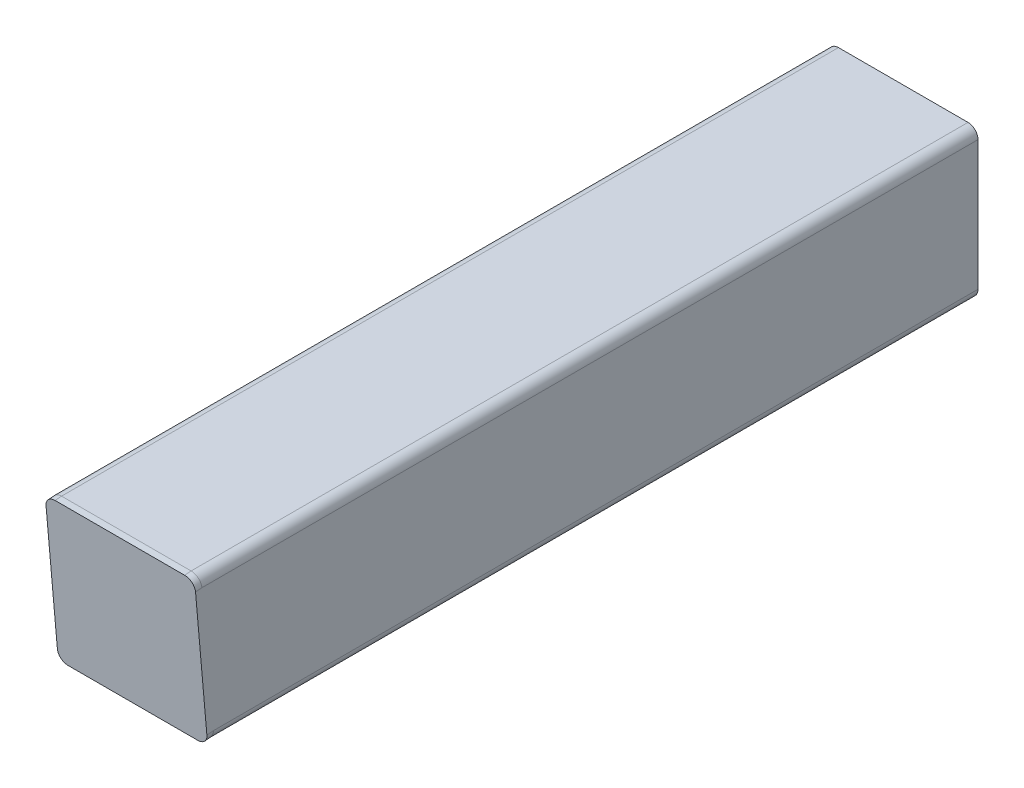
ISO-10303-21;
HEADER;
FILE_DESCRIPTION(('STEP AP214'),'2;1');
FILE_NAME('part.step','',(''),(''),'','','');
FILE_SCHEMA(('AUTOMOTIVE_DESIGN { 1 0 10303 214 1 1 1 1 }'));
ENDSEC;
DATA;
#1=APPLICATION_CONTEXT('core data for automotive mechanical design processes');
#2=APPLICATION_PROTOCOL_DEFINITION('international standard','automotive_design',2000,#1);
#3=PRODUCT_CONTEXT('',#1,'mechanical');
#4=PRODUCT('Part','Part','',(#3));
#5=PRODUCT_RELATED_PRODUCT_CATEGORY('part','',(#4));
#6=PRODUCT_DEFINITION_FORMATION('','',#4);
#7=PRODUCT_DEFINITION_CONTEXT('part definition',#1,'design');
#8=PRODUCT_DEFINITION('design','',#6,#7);
#9=PRODUCT_DEFINITION_SHAPE('','',#8);
#10=(LENGTH_UNIT() NAMED_UNIT(*) SI_UNIT(.MILLI.,.METRE.));
#11=(NAMED_UNIT(*) PLANE_ANGLE_UNIT() SI_UNIT($,.RADIAN.));
#12=(NAMED_UNIT(*) SI_UNIT($,.STERADIAN.) SOLID_ANGLE_UNIT());
#13=UNCERTAINTY_MEASURE_WITH_UNIT(LENGTH_MEASURE(1.E-05),#10,'distance_accuracy_value','');
#14=(GEOMETRIC_REPRESENTATION_CONTEXT(3) GLOBAL_UNCERTAINTY_ASSIGNED_CONTEXT((#13)) GLOBAL_UNIT_ASSIGNED_CONTEXT((#10,
#11,#12)) REPRESENTATION_CONTEXT('',''));
#15=CARTESIAN_POINT('',(0.,0.,0.));
#16=DIRECTION('',(0.,0.,1.));
#17=DIRECTION('',(1.,0.,0.));
#18=AXIS2_PLACEMENT_3D('',#15,#16,#17);
#19=CARTESIAN_POINT('',(2.54,-35.56,0.));
#20=DIRECTION('',(0.,0.,1.));
#21=DIRECTION('',(1.,0.,0.));
#22=AXIS2_PLACEMENT_3D('',#19,#20,#21);
#23=PLANE('',#22);
#24=CARTESIAN_POINT('',(2.54,-35.56,0.));
#25=DIRECTION('',(0.,0.,1.));
#26=DIRECTION('',(1.,0.,0.));
#27=AXIS2_PLACEMENT_3D('',#24,#25,#26);
#28=CIRCLE('',#27,2.54);
#29=CARTESIAN_POINT('',(0.,-35.56,0.));
#30=VERTEX_POINT('',#29);
#31=CARTESIAN_POINT('',(2.54000000000002,-38.1,0.));
#32=VERTEX_POINT('',#31);
#33=EDGE_CURVE('E361',#30,#32,#28,.T.);
#34=ORIENTED_EDGE('',*,*,#33,.F.);
#35=DIRECTION('',(0.,-1.,0.));
#36=VECTOR('',#35,1.);
#37=CARTESIAN_POINT('',(0.,-2.54000000000002,0.));
#38=LINE('',#37,#36);
#39=CARTESIAN_POINT('',(0.,-2.54000000000002,0.));
#40=VERTEX_POINT('',#39);
#41=EDGE_CURVE('E345',#40,#30,#38,.T.);
#42=ORIENTED_EDGE('',*,*,#41,.F.);
#43=CARTESIAN_POINT('',(2.54,-2.54,0.));
#44=DIRECTION('',(0.,0.,1.));
#45=DIRECTION('',(-1.,0.,0.));
#46=AXIS2_PLACEMENT_3D('',#43,#44,#45);
#47=CIRCLE('',#46,2.54);
#48=CARTESIAN_POINT('',(2.54000000000002,0.,0.));
#49=VERTEX_POINT('',#48);
#50=EDGE_CURVE('E348',#49,#40,#47,.T.);
#51=ORIENTED_EDGE('',*,*,#50,.F.);
#52=DIRECTION('',(-1.,0.,0.));
#53=VECTOR('',#52,1.);
#54=CARTESIAN_POINT('',(2.54000000000002,0.,0.));
#55=LINE('',#54,#53);
#56=CARTESIAN_POINT('',(35.56,0.,0.));
#57=VERTEX_POINT('',#56);
#58=EDGE_CURVE('E351',#57,#49,#55,.T.);
#59=ORIENTED_EDGE('',*,*,#58,.F.);
#60=CARTESIAN_POINT('',(35.56,-2.54,0.));
#61=DIRECTION('',(0.,0.,1.));
#62=DIRECTION('',(1.,0.,0.));
#63=AXIS2_PLACEMENT_3D('',#60,#61,#62);
#64=CIRCLE('',#63,2.54);
#65=CARTESIAN_POINT('',(38.1,-2.54000000000002,0.));
#66=VERTEX_POINT('',#65);
#67=EDGE_CURVE('E353',#66,#57,#64,.T.);
#68=ORIENTED_EDGE('',*,*,#67,.F.);
#69=DIRECTION('',(0.,1.,0.));
#70=VECTOR('',#69,1.);
#71=CARTESIAN_POINT('',(38.1,-2.54000000000002,0.));
#72=LINE('',#71,#70);
#73=CARTESIAN_POINT('',(38.1,-35.56,0.));
#74=VERTEX_POINT('',#73);
#75=EDGE_CURVE('E355',#74,#66,#72,.T.);
#76=ORIENTED_EDGE('',*,*,#75,.F.);
#77=CARTESIAN_POINT('',(35.56,-35.56,0.));
#78=DIRECTION('',(0.,0.,1.));
#79=DIRECTION('',(-1.,0.,0.));
#80=AXIS2_PLACEMENT_3D('',#77,#78,#79);
#81=CIRCLE('',#80,2.54);
#82=CARTESIAN_POINT('',(35.56,-38.1,0.));
#83=VERTEX_POINT('',#82);
#84=EDGE_CURVE('E358',#83,#74,#81,.T.);
#85=ORIENTED_EDGE('',*,*,#84,.F.);
#86=DIRECTION('',(1.,0.,0.));
#87=VECTOR('',#86,1.);
#88=CARTESIAN_POINT('',(2.54000000000002,-38.1,0.));
#89=LINE('',#88,#87);
#90=EDGE_CURVE('E324',#32,#83,#89,.T.);
#91=ORIENTED_EDGE('',*,*,#90,.F.);
#92=EDGE_LOOP('',(#34,#42,#51,#59,#68,#76,#85,#91));
#93=FACE_BOUND('',#92,.T.);
#94=CARTESIAN_POINT('',(5.3086,-32.7914,0.));
#95=DIRECTION('',(0.,0.,1.));
#96=DIRECTION('',(1.,0.,0.));
#97=AXIS2_PLACEMENT_3D('',#94,#95,#96);
#98=CIRCLE('',#97,2.54);
#99=CARTESIAN_POINT('',(2.7686,-32.7914,0.));
#100=VERTEX_POINT('',#99);
#101=CARTESIAN_POINT('',(5.30860000000002,-35.3314,0.));
#102=VERTEX_POINT('',#101);
#103=EDGE_CURVE('E403',#100,#102,#98,.T.);
#104=ORIENTED_EDGE('',*,*,#103,.T.);
#105=DIRECTION('',(1.,0.,0.));
#106=VECTOR('',#105,1.);
#107=CARTESIAN_POINT('',(5.30860000000002,-35.3314,0.));
#108=LINE('',#107,#106);
#109=CARTESIAN_POINT('',(32.7914,-35.3314,0.));
#110=VERTEX_POINT('',#109);
#111=EDGE_CURVE('E400',#102,#110,#108,.T.);
#112=ORIENTED_EDGE('',*,*,#111,.T.);
#113=CARTESIAN_POINT('',(32.7914,-32.7914,0.));
#114=DIRECTION('',(0.,0.,1.));
#115=DIRECTION('',(1.,0.,0.));
#116=AXIS2_PLACEMENT_3D('',#113,#114,#115);
#117=CIRCLE('',#116,2.54);
#118=CARTESIAN_POINT('',(35.3314,-32.7914,0.));
#119=VERTEX_POINT('',#118);
#120=EDGE_CURVE('E397',#110,#119,#117,.T.);
#121=ORIENTED_EDGE('',*,*,#120,.T.);
#122=DIRECTION('',(0.,1.,0.));
#123=VECTOR('',#122,1.);
#124=CARTESIAN_POINT('',(35.3314,-5.30860000000002,0.));
#125=LINE('',#124,#123);
#126=CARTESIAN_POINT('',(35.3314,-5.30860000000002,0.));
#127=VERTEX_POINT('',#126);
#128=EDGE_CURVE('E394',#119,#127,#125,.T.);
#129=ORIENTED_EDGE('',*,*,#128,.T.);
#130=CARTESIAN_POINT('',(32.7914,-5.3086,0.));
#131=DIRECTION('',(0.,0.,1.));
#132=DIRECTION('',(1.,0.,0.));
#133=AXIS2_PLACEMENT_3D('',#130,#131,#132);
#134=CIRCLE('',#133,2.54);
#135=CARTESIAN_POINT('',(32.7914,-2.7686,0.));
#136=VERTEX_POINT('',#135);
#137=EDGE_CURVE('E391',#127,#136,#134,.T.);
#138=ORIENTED_EDGE('',*,*,#137,.T.);
#139=DIRECTION('',(-1.,0.,0.));
#140=VECTOR('',#139,1.);
#141=CARTESIAN_POINT('',(5.30860000000002,-2.7686,0.));
#142=LINE('',#141,#140);
#143=CARTESIAN_POINT('',(5.30860000000002,-2.7686,0.));
#144=VERTEX_POINT('',#143);
#145=EDGE_CURVE('E388',#136,#144,#142,.T.);
#146=ORIENTED_EDGE('',*,*,#145,.T.);
#147=CARTESIAN_POINT('',(5.3086,-5.3086,0.));
#148=DIRECTION('',(0.,0.,1.));
#149=DIRECTION('',(1.,0.,0.));
#150=AXIS2_PLACEMENT_3D('',#147,#148,#149);
#151=CIRCLE('',#150,2.54);
#152=CARTESIAN_POINT('',(2.7686,-5.30860000000002,0.));
#153=VERTEX_POINT('',#152);
#154=EDGE_CURVE('E385',#144,#153,#151,.T.);
#155=ORIENTED_EDGE('',*,*,#154,.T.);
#156=DIRECTION('',(0.,-1.,0.));
#157=VECTOR('',#156,1.);
#158=CARTESIAN_POINT('',(2.7686,-5.30860000000002,0.));
#159=LINE('',#158,#157);
#160=EDGE_CURVE('E382',#153,#100,#159,.T.);
#161=ORIENTED_EDGE('',*,*,#160,.T.);
#162=EDGE_LOOP('',(#104,#112,#121,#129,#138,#146,#155,#161));
#163=FACE_BOUND('',#162,.T.);
#164=ADVANCED_FACE('F36',(#93,#163),#23,.F.);
#165=CARTESIAN_POINT('',(2.54,-35.56,198.));
#166=DIRECTION('',(0.,0.,-1.));
#167=DIRECTION('',(-1.,0.,0.));
#168=AXIS2_PLACEMENT_3D('',#165,#166,#167);
#169=CYLINDRICAL_SURFACE('',#168,2.54);
#170=DIRECTION('',(0.,0.,-1.));
#171=VECTOR('',#170,1.);
#172=CARTESIAN_POINT('',(2.54000000000002,-38.1,198.));
#173=LINE('',#172,#171);
#174=CARTESIAN_POINT('',(2.54000000000002,-38.1,194.666681919663));
#175=VERTEX_POINT('',#174);
#176=EDGE_CURVE('E44',#175,#32,#173,.T.);
#177=ORIENTED_EDGE('',*,*,#176,.F.);
#178=CARTESIAN_POINT('',(2.54,-35.56,194.888903125018));
#179=DIRECTION('',(0.,0.0871557427476518,-0.996194698091746));
#180=DIRECTION('',(0.,-0.996194698091746,-0.0871557427476518));
#181=AXIS2_PLACEMENT_3D('',#178,#179,#180);
#182=ELLIPSE('',#181,2.5497023873601,2.54);
#183=CARTESIAN_POINT('',(0.,-35.56,194.888903125018));
#184=VERTEX_POINT('',#183);
#185=EDGE_CURVE('E406',#175,#184,#182,.T.);
#186=ORIENTED_EDGE('',*,*,#185,.T.);
#187=DIRECTION('',(0.,0.,-1.));
#188=VECTOR('',#187,1.);
#189=CARTESIAN_POINT('',(0.,-35.56,198.));
#190=LINE('',#189,#188);
#191=EDGE_CURVE('E342',#184,#30,#190,.T.);
#192=ORIENTED_EDGE('',*,*,#191,.T.);
#193=ORIENTED_EDGE('',*,*,#33,.T.);
#194=EDGE_LOOP('',(#177,#186,#192,#193));
#195=FACE_BOUND('',#194,.T.);
#196=ADVANCED_FACE('F38',(#195),#169,.T.);
#197=CARTESIAN_POINT('',(2.54000000000002,-38.1,198.));
#198=DIRECTION('',(0.,1.,0.));
#199=DIRECTION('',(0.,0.,1.));
#200=AXIS2_PLACEMENT_3D('',#197,#198,#199);
#201=PLANE('',#200);
#202=DIRECTION('',(0.,0.,-1.));
#203=VECTOR('',#202,1.);
#204=CARTESIAN_POINT('',(35.56,-38.1,198.));
#205=LINE('',#204,#203);
#206=CARTESIAN_POINT('',(35.56,-38.1,194.666681919663));
#207=VERTEX_POINT('',#206);
#208=EDGE_CURVE('E321',#207,#83,#205,.T.);
#209=ORIENTED_EDGE('',*,*,#208,.F.);
#210=DIRECTION('',(1.,0.,0.));
#211=VECTOR('',#210,1.);
#212=CARTESIAN_POINT('',(0.,-38.1,194.666681919663));
#213=LINE('',#212,#211);
#214=EDGE_CURVE('E192',#175,#207,#213,.T.);
#215=ORIENTED_EDGE('',*,*,#214,.F.);
#216=ORIENTED_EDGE('',*,*,#176,.T.);
#217=ORIENTED_EDGE('',*,*,#90,.T.);
#218=EDGE_LOOP('',(#209,#215,#216,#217));
#219=FACE_BOUND('',#218,.T.);
#220=ADVANCED_FACE('F310',(#219),#201,.F.);
#221=CARTESIAN_POINT('',(35.56,-35.56,198.));
#222=DIRECTION('',(0.,0.,-1.));
#223=DIRECTION('',(-1.,0.,0.));
#224=AXIS2_PLACEMENT_3D('',#221,#222,#223);
#225=CYLINDRICAL_SURFACE('',#224,2.54);
#226=DIRECTION('',(0.,0.,-1.));
#227=VECTOR('',#226,1.);
#228=CARTESIAN_POINT('',(38.1,-35.56,198.));
#229=LINE('',#228,#227);
#230=CARTESIAN_POINT('',(38.1,-35.56,194.888903125018));
#231=VERTEX_POINT('',#230);
#232=EDGE_CURVE('E328',#231,#74,#229,.T.);
#233=ORIENTED_EDGE('',*,*,#232,.F.);
#234=CARTESIAN_POINT('',(35.56,-35.56,194.888903125018));
#235=DIRECTION('',(0.,0.0871557427476518,-0.996194698091746));
#236=DIRECTION('',(0.,-0.996194698091746,-0.0871557427476518));
#237=AXIS2_PLACEMENT_3D('',#234,#235,#236);
#238=ELLIPSE('',#237,2.5497023873601,2.54);
#239=EDGE_CURVE('E409',#231,#207,#238,.T.);
#240=ORIENTED_EDGE('',*,*,#239,.T.);
#241=ORIENTED_EDGE('',*,*,#208,.T.);
#242=ORIENTED_EDGE('',*,*,#84,.T.);
#243=EDGE_LOOP('',(#233,#240,#241,#242));
#244=FACE_BOUND('',#243,.T.);
#245=ADVANCED_FACE('F307',(#244),#225,.T.);
#246=CARTESIAN_POINT('',(38.1,-2.54000000000002,198.));
#247=DIRECTION('',(-1.,0.,0.));
#248=DIRECTION('',(0.,-1.,0.));
#249=AXIS2_PLACEMENT_3D('',#246,#247,#248);
#250=PLANE('',#249);
#251=DIRECTION('',(0.,0.,-1.));
#252=VECTOR('',#251,1.);
#253=CARTESIAN_POINT('',(38.1,-2.54000000000002,198.));
#254=LINE('',#253,#252);
#255=CARTESIAN_POINT('',(38.1,-2.54000000000001,197.777778794644));
#256=VERTEX_POINT('',#255);
#257=EDGE_CURVE('E330',#256,#66,#254,.T.);
#258=ORIENTED_EDGE('',*,*,#257,.F.);
#259=DIRECTION('',(0.,0.0871557427476519,-0.996194698091746));
#260=VECTOR('',#259,1.);
#261=CARTESIAN_POINT('',(38.1,-7.38767767896877,253.18698821219));
#262=LINE('',#261,#260);
#263=CARTESIAN_POINT('',(38.1,-2.68261463479052,199.407871529439));
#264=VERTEX_POINT('',#263);
#265=EDGE_CURVE('E217',#264,#256,#262,.T.);
#266=ORIENTED_EDGE('',*,*,#265,.F.);
#267=DIRECTION('',(0.,0.996194698091746,0.0871557427476584));
#268=VECTOR('',#267,1.);
#269=CARTESIAN_POINT('',(38.1,-35.7026146347917,196.518995859831));
#270=LINE('',#269,#268);
#271=CARTESIAN_POINT('',(38.1,-35.7026146347921,196.518995859831));
#272=VERTEX_POINT('',#271);
#273=EDGE_CURVE('E201',#272,#264,#270,.T.);
#274=ORIENTED_EDGE('',*,*,#273,.F.);
#275=DIRECTION('',(0.,0.0871557427476519,-0.996194698091746));
#276=VECTOR('',#275,1.);
#277=CARTESIAN_POINT('',(38.1,-40.4076776789688,250.298112542564));
#278=LINE('',#277,#276);
#279=EDGE_CURVE('E215',#272,#231,#278,.T.);
#280=ORIENTED_EDGE('',*,*,#279,.T.);
#281=ORIENTED_EDGE('',*,*,#232,.T.);
#282=ORIENTED_EDGE('',*,*,#75,.T.);
#283=EDGE_LOOP('',(#258,#266,#274,#280,#281,#282));
#284=FACE_BOUND('',#283,.T.);
#285=ADVANCED_FACE('F303',(#284),#250,.F.);
#286=CARTESIAN_POINT('',(35.56,-2.54,198.));
#287=DIRECTION('',(0.,0.,-1.));
#288=DIRECTION('',(-1.,0.,0.));
#289=AXIS2_PLACEMENT_3D('',#286,#287,#288);
#290=CYLINDRICAL_SURFACE('',#289,2.54);
#291=DIRECTION('',(0.,0.,-1.));
#292=VECTOR('',#291,1.);
#293=CARTESIAN_POINT('',(35.56,0.,198.));
#294=LINE('',#293,#292);
#295=CARTESIAN_POINT('',(35.56,0.,198.));
#296=VERTEX_POINT('',#295);
#297=EDGE_CURVE('E334',#296,#57,#294,.T.);
#298=ORIENTED_EDGE('',*,*,#297,.F.);
#299=CARTESIAN_POINT('',(35.56,-2.54,197.777778794644));
#300=DIRECTION('',(0.,0.0871557427476518,-0.996194698091746));
#301=DIRECTION('',(0.,-0.996194698091746,-0.0871557427476518));
#302=AXIS2_PLACEMENT_3D('',#299,#300,#301);
#303=ELLIPSE('',#302,2.5497023873601,2.54);
#304=EDGE_CURVE('E411',#296,#256,#303,.T.);
#305=ORIENTED_EDGE('',*,*,#304,.T.);
#306=ORIENTED_EDGE('',*,*,#257,.T.);
#307=ORIENTED_EDGE('',*,*,#67,.T.);
#308=EDGE_LOOP('',(#298,#305,#306,#307));
#309=FACE_BOUND('',#308,.T.);
#310=ADVANCED_FACE('F299',(#309),#290,.T.);
#311=CARTESIAN_POINT('',(2.54000000000002,0.,198.));
#312=DIRECTION('',(0.,-1.,0.));
#313=DIRECTION('',(0.,0.,-1.));
#314=AXIS2_PLACEMENT_3D('',#311,#312,#313);
#315=PLANE('',#314);
#316=ORIENTED_EDGE('',*,*,#58,.T.);
#317=DIRECTION('',(0.,0.,-1.));
#318=VECTOR('',#317,1.);
#319=CARTESIAN_POINT('',(2.54000000000002,0.,198.));
#320=LINE('',#319,#318);
#321=CARTESIAN_POINT('',(2.54,0.,198.));
#322=VERTEX_POINT('',#321);
#323=EDGE_CURVE('E337',#322,#49,#320,.T.);
#324=ORIENTED_EDGE('',*,*,#323,.F.);
#325=DIRECTION('',(-1.,0.,0.));
#326=VECTOR('',#325,1.);
#327=CARTESIAN_POINT('',(2.54000000000002,0.,198.));
#328=LINE('',#327,#326);
#329=EDGE_CURVE('E344',#296,#322,#328,.T.);
#330=ORIENTED_EDGE('',*,*,#329,.F.);
#331=ORIENTED_EDGE('',*,*,#297,.T.);
#332=EDGE_LOOP('',(#316,#324,#330,#331));
#333=FACE_BOUND('',#332,.T.);
#334=ADVANCED_FACE('F295',(#333),#315,.F.);
#335=CARTESIAN_POINT('',(2.54,-2.54,198.));
#336=DIRECTION('',(0.,0.,-1.));
#337=DIRECTION('',(-1.,0.,0.));
#338=AXIS2_PLACEMENT_3D('',#335,#336,#337);
#339=CYLINDRICAL_SURFACE('',#338,2.54);
#340=DIRECTION('',(0.,0.,-1.));
#341=VECTOR('',#340,1.);
#342=CARTESIAN_POINT('',(0.,-2.54000000000002,198.));
#343=LINE('',#342,#341);
#344=CARTESIAN_POINT('',(0.,-2.54000000000002,197.777778794644));
#345=VERTEX_POINT('',#344);
#346=EDGE_CURVE('E340',#345,#40,#343,.T.);
#347=ORIENTED_EDGE('',*,*,#346,.F.);
#348=CARTESIAN_POINT('',(2.54,-2.54,197.777778794644));
#349=DIRECTION('',(0.,0.0871557427476518,-0.996194698091746));
#350=DIRECTION('',(0.,-0.996194698091746,-0.0871557427476518));
#351=AXIS2_PLACEMENT_3D('',#348,#349,#350);
#352=ELLIPSE('',#351,2.5497023873601,2.54);
#353=EDGE_CURVE('E51',#345,#322,#352,.T.);
#354=ORIENTED_EDGE('',*,*,#353,.T.);
#355=ORIENTED_EDGE('',*,*,#323,.T.);
#356=ORIENTED_EDGE('',*,*,#50,.T.);
#357=EDGE_LOOP('',(#347,#354,#355,#356));
#358=FACE_BOUND('',#357,.T.);
#359=ADVANCED_FACE('F292',(#358),#339,.T.);
#360=CARTESIAN_POINT('',(0.,-2.54000000000002,198.));
#361=DIRECTION('',(1.,0.,0.));
#362=DIRECTION('',(0.,1.,0.));
#363=AXIS2_PLACEMENT_3D('',#360,#361,#362);
#364=PLANE('',#363);
#365=ORIENTED_EDGE('',*,*,#191,.F.);
#366=DIRECTION('',(0.,0.0871557427476519,-0.996194698091746));
#367=VECTOR('',#366,1.);
#368=CARTESIAN_POINT('',(0.,-40.4076776789688,250.298112542564));
#369=LINE('',#368,#367);
#370=CARTESIAN_POINT('',(0.,-35.702614634792,196.518995859831));
#371=VERTEX_POINT('',#370);
#372=EDGE_CURVE('E182',#371,#184,#369,.T.);
#373=ORIENTED_EDGE('',*,*,#372,.F.);
#374=DIRECTION('',(0.,-0.996194698091746,-0.0871557427476584));
#375=VECTOR('',#374,1.);
#376=CARTESIAN_POINT('',(0.,-2.68261463479174,199.407871529457));
#377=LINE('',#376,#375);
#378=CARTESIAN_POINT('',(0.,-2.68261463479209,199.407871529457));
#379=VERTEX_POINT('',#378);
#380=EDGE_CURVE('E176',#379,#371,#377,.T.);
#381=ORIENTED_EDGE('',*,*,#380,.F.);
#382=DIRECTION('',(0.,0.0871557427476519,-0.996194698091746));
#383=VECTOR('',#382,1.);
#384=CARTESIAN_POINT('',(0.,-7.38767767896879,253.18698821219));
#385=LINE('',#384,#383);
#386=EDGE_CURVE('E168',#379,#345,#385,.T.);
#387=ORIENTED_EDGE('',*,*,#386,.T.);
#388=ORIENTED_EDGE('',*,*,#346,.T.);
#389=ORIENTED_EDGE('',*,*,#41,.T.);
#390=EDGE_LOOP('',(#365,#373,#381,#387,#388,#389));
#391=FACE_BOUND('',#390,.T.);
#392=ADVANCED_FACE('F181',(#391),#364,.F.);
#393=CARTESIAN_POINT('',(5.3086,-32.7914,198.));
#394=DIRECTION('',(0.,0.,-1.));
#395=DIRECTION('',(-1.,0.,0.));
#396=AXIS2_PLACEMENT_3D('',#393,#394,#395);
#397=CYLINDRICAL_SURFACE('',#396,2.54);
#398=CARTESIAN_POINT('',(5.3086,-32.7914,195.131124238856));
#399=DIRECTION('',(0.,0.0871557427476518,-0.996194698091746));
#400=DIRECTION('',(0.,-0.996194698091746,-0.0871557427476518));
#401=AXIS2_PLACEMENT_3D('',#398,#399,#400);
#402=ELLIPSE('',#401,2.5497023873601,2.54);
#403=CARTESIAN_POINT('',(5.30860000000002,-35.3314,194.9089030335));
#404=VERTEX_POINT('',#403);
#405=CARTESIAN_POINT('',(2.7686,-32.7914,195.131124238856));
#406=VERTEX_POINT('',#405);
#407=EDGE_CURVE('E415',#404,#406,#402,.T.);
#408=ORIENTED_EDGE('',*,*,#407,.F.);
#409=DIRECTION('',(0.,0.,-1.));
#410=VECTOR('',#409,1.);
#411=CARTESIAN_POINT('',(5.30860000000002,-35.3314,198.));
#412=LINE('',#411,#410);
#413=EDGE_CURVE('E364',#404,#102,#412,.T.);
#414=ORIENTED_EDGE('',*,*,#413,.T.);
#415=ORIENTED_EDGE('',*,*,#103,.F.);
#416=DIRECTION('',(0.,0.,-1.));
#417=VECTOR('',#416,1.);
#418=CARTESIAN_POINT('',(2.7686,-32.7914,198.));
#419=LINE('',#418,#417);
#420=EDGE_CURVE('E380',#406,#100,#419,.T.);
#421=ORIENTED_EDGE('',*,*,#420,.F.);
#422=EDGE_LOOP('',(#408,#414,#415,#421));
#423=FACE_BOUND('',#422,.T.);
#424=ADVANCED_FACE('F282',(#423),#397,.F.);
#425=CARTESIAN_POINT('',(5.30860000000002,-35.3314,198.));
#426=DIRECTION('',(0.,1.,0.));
#427=DIRECTION('',(0.,0.,1.));
#428=AXIS2_PLACEMENT_3D('',#425,#426,#427);
#429=PLANE('',#428);
#430=DIRECTION('',(-1.,0.,0.));
#431=VECTOR('',#430,1.);
#432=CARTESIAN_POINT('',(5.30860000000002,-35.3314,194.9089030335));
#433=LINE('',#432,#431);
#434=CARTESIAN_POINT('',(32.7914,-35.3314,194.9089030335));
#435=VERTEX_POINT('',#434);
#436=EDGE_CURVE('E418',#435,#404,#433,.T.);
#437=ORIENTED_EDGE('',*,*,#436,.F.);
#438=DIRECTION('',(0.,0.,-1.));
#439=VECTOR('',#438,1.);
#440=CARTESIAN_POINT('',(32.7914,-35.3314,198.));
#441=LINE('',#440,#439);
#442=EDGE_CURVE('E368',#435,#110,#441,.T.);
#443=ORIENTED_EDGE('',*,*,#442,.T.);
#444=ORIENTED_EDGE('',*,*,#111,.F.);
#445=ORIENTED_EDGE('',*,*,#413,.F.);
#446=EDGE_LOOP('',(#437,#443,#444,#445));
#447=FACE_BOUND('',#446,.T.);
#448=ADVANCED_FACE('F278',(#447),#429,.T.);
#449=CARTESIAN_POINT('',(32.7914,-32.7914,198.));
#450=DIRECTION('',(0.,0.,-1.));
#451=DIRECTION('',(-1.,0.,0.));
#452=AXIS2_PLACEMENT_3D('',#449,#450,#451);
#453=CYLINDRICAL_SURFACE('',#452,2.54);
#454=CARTESIAN_POINT('',(32.7914,-32.7914,195.131124238856));
#455=DIRECTION('',(0.,0.0871557427476518,-0.996194698091746));
#456=DIRECTION('',(0.,-0.996194698091746,-0.0871557427476518));
#457=AXIS2_PLACEMENT_3D('',#454,#455,#456);
#458=ELLIPSE('',#457,2.5497023873601,2.54);
#459=CARTESIAN_POINT('',(35.3314,-32.7914,195.131124238856));
#460=VERTEX_POINT('',#459);
#461=EDGE_CURVE('E421',#460,#435,#458,.T.);
#462=ORIENTED_EDGE('',*,*,#461,.F.);
#463=DIRECTION('',(0.,0.,-1.));
#464=VECTOR('',#463,1.);
#465=CARTESIAN_POINT('',(35.3314,-32.7914,198.));
#466=LINE('',#465,#464);
#467=EDGE_CURVE('E370',#460,#119,#466,.T.);
#468=ORIENTED_EDGE('',*,*,#467,.T.);
#469=ORIENTED_EDGE('',*,*,#120,.F.);
#470=ORIENTED_EDGE('',*,*,#442,.F.);
#471=EDGE_LOOP('',(#462,#468,#469,#470));
#472=FACE_BOUND('',#471,.T.);
#473=ADVANCED_FACE('F274',(#472),#453,.F.);
#474=CARTESIAN_POINT('',(35.3314,-5.30860000000002,198.));
#475=DIRECTION('',(-1.,0.,0.));
#476=DIRECTION('',(0.,0.,1.));
#477=AXIS2_PLACEMENT_3D('',#474,#475,#476);
#478=PLANE('',#477);
#479=DIRECTION('',(0.,-0.996194698091746,-0.0871557427476518));
#480=VECTOR('',#479,1.);
#481=CARTESIAN_POINT('',(35.3314,-5.26827521882033,197.539085642019));
#482=LINE('',#481,#480);
#483=CARTESIAN_POINT('',(35.3314,-5.30860000000002,197.535557680806));
#484=VERTEX_POINT('',#483);
#485=EDGE_CURVE('E424',#484,#460,#482,.T.);
#486=ORIENTED_EDGE('',*,*,#485,.F.);
#487=DIRECTION('',(0.,0.,-1.));
#488=VECTOR('',#487,1.);
#489=CARTESIAN_POINT('',(35.3314,-5.30860000000002,198.));
#490=LINE('',#489,#488);
#491=EDGE_CURVE('E372',#484,#127,#490,.T.);
#492=ORIENTED_EDGE('',*,*,#491,.T.);
#493=ORIENTED_EDGE('',*,*,#128,.F.);
#494=ORIENTED_EDGE('',*,*,#467,.F.);
#495=EDGE_LOOP('',(#486,#492,#493,#494));
#496=FACE_BOUND('',#495,.T.);
#497=ADVANCED_FACE('F270',(#496),#478,.T.);
#498=CARTESIAN_POINT('',(32.7914,-5.3086,198.));
#499=DIRECTION('',(0.,0.,-1.));
#500=DIRECTION('',(-1.,0.,0.));
#501=AXIS2_PLACEMENT_3D('',#498,#499,#500);
#502=CYLINDRICAL_SURFACE('',#501,2.54);
#503=CARTESIAN_POINT('',(32.7914,-5.3086,197.535557680806));
#504=DIRECTION('',(0.,0.0871557427476518,-0.996194698091746));
#505=DIRECTION('',(0.,-0.996194698091746,-0.0871557427476518));
#506=AXIS2_PLACEMENT_3D('',#503,#504,#505);
#507=ELLIPSE('',#506,2.5497023873601,2.54);
#508=CARTESIAN_POINT('',(32.7914,-2.7686,197.757778886162));
#509=VERTEX_POINT('',#508);
#510=EDGE_CURVE('E427',#509,#484,#507,.T.);
#511=ORIENTED_EDGE('',*,*,#510,.F.);
#512=DIRECTION('',(0.,0.,-1.));
#513=VECTOR('',#512,1.);
#514=CARTESIAN_POINT('',(32.7914,-2.7686,198.));
#515=LINE('',#514,#513);
#516=EDGE_CURVE('E374',#509,#136,#515,.T.);
#517=ORIENTED_EDGE('',*,*,#516,.T.);
#518=ORIENTED_EDGE('',*,*,#137,.F.);
#519=ORIENTED_EDGE('',*,*,#491,.F.);
#520=EDGE_LOOP('',(#511,#517,#518,#519));
#521=FACE_BOUND('',#520,.T.);
#522=ADVANCED_FACE('F266',(#521),#502,.F.);
#523=CARTESIAN_POINT('',(5.30860000000002,-2.7686,198.));
#524=DIRECTION('',(0.,-1.,0.));
#525=DIRECTION('',(0.,0.,-1.));
#526=AXIS2_PLACEMENT_3D('',#523,#524,#525);
#527=PLANE('',#526);
#528=DIRECTION('',(1.,0.,0.));
#529=VECTOR('',#528,1.);
#530=CARTESIAN_POINT('',(5.30860000000002,-2.7686,197.757778886162));
#531=LINE('',#530,#529);
#532=CARTESIAN_POINT('',(5.30860000000002,-2.7686,197.757778886162));
#533=VERTEX_POINT('',#532);
#534=EDGE_CURVE('E430',#533,#509,#531,.T.);
#535=ORIENTED_EDGE('',*,*,#534,.F.);
#536=DIRECTION('',(0.,0.,-1.));
#537=VECTOR('',#536,1.);
#538=CARTESIAN_POINT('',(5.30860000000002,-2.7686,198.));
#539=LINE('',#538,#537);
#540=EDGE_CURVE('E376',#533,#144,#539,.T.);
#541=ORIENTED_EDGE('',*,*,#540,.T.);
#542=ORIENTED_EDGE('',*,*,#145,.F.);
#543=ORIENTED_EDGE('',*,*,#516,.F.);
#544=EDGE_LOOP('',(#535,#541,#542,#543));
#545=FACE_BOUND('',#544,.T.);
#546=ADVANCED_FACE('F262',(#545),#527,.T.);
#547=CARTESIAN_POINT('',(5.3086,-5.3086,198.));
#548=DIRECTION('',(0.,0.,-1.));
#549=DIRECTION('',(-1.,0.,0.));
#550=AXIS2_PLACEMENT_3D('',#547,#548,#549);
#551=CYLINDRICAL_SURFACE('',#550,2.54);
#552=CARTESIAN_POINT('',(5.3086,-5.3086,197.535557680806));
#553=DIRECTION('',(0.,0.0871557427476518,-0.996194698091746));
#554=DIRECTION('',(0.,-0.996194698091746,-0.0871557427476518));
#555=AXIS2_PLACEMENT_3D('',#552,#553,#554);
#556=ELLIPSE('',#555,2.5497023873601,2.54);
#557=CARTESIAN_POINT('',(2.7686,-5.30860000000002,197.535557680806));
#558=VERTEX_POINT('',#557);
#559=EDGE_CURVE('E195',#558,#533,#556,.T.);
#560=ORIENTED_EDGE('',*,*,#559,.F.);
#561=DIRECTION('',(0.,0.,-1.));
#562=VECTOR('',#561,1.);
#563=CARTESIAN_POINT('',(2.7686,-5.30860000000002,198.));
#564=LINE('',#563,#562);
#565=EDGE_CURVE('E378',#558,#153,#564,.T.);
#566=ORIENTED_EDGE('',*,*,#565,.T.);
#567=ORIENTED_EDGE('',*,*,#154,.F.);
#568=ORIENTED_EDGE('',*,*,#540,.F.);
#569=EDGE_LOOP('',(#560,#566,#567,#568));
#570=FACE_BOUND('',#569,.T.);
#571=ADVANCED_FACE('F259',(#570),#551,.F.);
#572=CARTESIAN_POINT('',(2.7686,-5.30860000000002,198.));
#573=DIRECTION('',(1.,0.,0.));
#574=DIRECTION('',(0.,0.,-1.));
#575=AXIS2_PLACEMENT_3D('',#572,#573,#574);
#576=PLANE('',#575);
#577=DIRECTION('',(0.,0.996194698091746,0.0871557427476518));
#578=VECTOR('',#577,1.);
#579=CARTESIAN_POINT('',(2.7686,-5.26827521882033,197.539085642019));
#580=LINE('',#579,#578);
#581=EDGE_CURVE('E11',#406,#558,#580,.T.);
#582=ORIENTED_EDGE('',*,*,#581,.F.);
#583=ORIENTED_EDGE('',*,*,#420,.T.);
#584=ORIENTED_EDGE('',*,*,#160,.F.);
#585=ORIENTED_EDGE('',*,*,#565,.F.);
#586=EDGE_LOOP('',(#582,#583,#584,#585));
#587=FACE_BOUND('',#586,.T.);
#588=ADVANCED_FACE('F256',(#587),#576,.T.);
#589=CARTESIAN_POINT('',(2.54000000000003,-2715.75285666004,-37.9550179972877));
#590=DIRECTION('',(0.,-0.0871557427476584,0.996194698091746));
#591=DIRECTION('',(0.,-0.996194698091746,-0.0871557427476584));
#592=AXIS2_PLACEMENT_3D('',#589,#590,#591);
#593=PLANE('',#592);
#594=ORIENTED_EDGE('',*,*,#380,.T.);
#595=CARTESIAN_POINT('',(2.54,-35.7026146347905,196.518995859813));
#596=DIRECTION('',(0.,-0.0871557427476519,0.996194698091746));
#597=DIRECTION('',(0.,-0.996194698091746,-0.0871557427476519));
#598=AXIS2_PLACEMENT_3D('',#595,#596,#597);
#599=ELLIPSE('',#598,2.5497023873601,2.54);
#600=CARTESIAN_POINT('',(2.54000000000002,-38.2426146347921,196.296774654475));
#601=VERTEX_POINT('',#600);
#602=EDGE_CURVE('E186',#371,#601,#599,.T.);
#603=ORIENTED_EDGE('',*,*,#602,.T.);
#604=DIRECTION('',(1.,0.,0.));
#605=VECTOR('',#604,1.);
#606=CARTESIAN_POINT('',(2.54000000000001,-38.2426146347921,196.296774654475));
#607=LINE('',#606,#605);
#608=CARTESIAN_POINT('',(35.56,-38.2426146347905,196.296774654458));
#609=VERTEX_POINT('',#608);
#610=EDGE_CURVE('E207',#601,#609,#607,.T.);
#611=ORIENTED_EDGE('',*,*,#610,.T.);
#612=CARTESIAN_POINT('',(35.56,-35.7026146347905,196.518995859813));
#613=DIRECTION('',(0.,-0.0871557427476519,0.996194698091746));
#614=DIRECTION('',(0.,-0.996194698091746,-0.0871557427476519));
#615=AXIS2_PLACEMENT_3D('',#612,#613,#614);
#616=ELLIPSE('',#615,2.5497023873601,2.54);
#617=EDGE_CURVE('E204',#609,#272,#616,.T.);
#618=ORIENTED_EDGE('',*,*,#617,.T.);
#619=ORIENTED_EDGE('',*,*,#273,.T.);
#620=CARTESIAN_POINT('',(35.56,-2.68261463479052,199.407871529439));
#621=DIRECTION('',(0.,-0.0871557427476519,0.996194698091746));
#622=DIRECTION('',(0.,-0.996194698091746,-0.0871557427476519));
#623=AXIS2_PLACEMENT_3D('',#620,#621,#622);
#624=ELLIPSE('',#623,2.5497023873601,2.54);
#625=CARTESIAN_POINT('',(35.56,-0.14261463479208,199.630092734813));
#626=VERTEX_POINT('',#625);
#627=EDGE_CURVE('E197',#264,#626,#624,.T.);
#628=ORIENTED_EDGE('',*,*,#627,.T.);
#629=DIRECTION('',(-1.,0.,0.));
#630=VECTOR('',#629,1.);
#631=CARTESIAN_POINT('',(35.56,-0.142614634792078,199.630092734813));
#632=LINE('',#631,#630);
#633=CARTESIAN_POINT('',(2.54,-0.142614634790522,199.630092734795));
#634=VERTEX_POINT('',#633);
#635=EDGE_CURVE('E191',#626,#634,#632,.T.);
#636=ORIENTED_EDGE('',*,*,#635,.T.);
#637=CARTESIAN_POINT('',(2.54,-2.68261463479052,199.407871529439));
#638=DIRECTION('',(0.,-0.0871557427476519,0.996194698091746));
#639=DIRECTION('',(0.,-0.996194698091746,-0.0871557427476519));
#640=AXIS2_PLACEMENT_3D('',#637,#638,#639);
#641=ELLIPSE('',#640,2.5497023873601,2.54);
#642=EDGE_CURVE('E172',#634,#379,#641,.T.);
#643=ORIENTED_EDGE('',*,*,#642,.T.);
#644=EDGE_LOOP('',(#594,#603,#611,#618,#619,#628,#636,#643));
#645=FACE_BOUND('',#644,.T.);
#646=ADVANCED_FACE('F189',(#645),#593,.T.);
#647=CARTESIAN_POINT('',(2.54,-7.38767767896877,253.18698821219));
#648=DIRECTION('',(0.,-0.0871557427476519,0.996194698091746));
#649=DIRECTION('',(0.,-0.996194698091746,-0.0871557427476519));
#650=AXIS2_PLACEMENT_3D('',#647,#648,#649);
#651=ELLIPSE('',#650,2.5497023873601,2.54);
#652=DIRECTION('',(0.,0.0871557427476519,-0.996194698091746));
#653=VECTOR('',#652,1.);
#654=SURFACE_OF_LINEAR_EXTRUSION('',#651,#653);
#655=ORIENTED_EDGE('',*,*,#642,.F.);
#656=DIRECTION('',(0.,0.0871557427476519,-0.996194698091746));
#657=VECTOR('',#656,1.);
#658=CARTESIAN_POINT('',(2.54,-4.84767767896877,253.409209417546));
#659=LINE('',#658,#657);
#660=EDGE_CURVE('E177',#634,#322,#659,.T.);
#661=ORIENTED_EDGE('',*,*,#660,.T.);
#662=ORIENTED_EDGE('',*,*,#353,.F.);
#663=ORIENTED_EDGE('',*,*,#386,.F.);
#664=EDGE_LOOP('',(#655,#661,#662,#663));
#665=FACE_BOUND('',#664,.T.);
#666=ADVANCED_FACE('F170',(#665),#654,.F.);
#667=CARTESIAN_POINT('',(35.56,-4.84767767896877,253.409209417546));
#668=DIRECTION('',(0.,-0.996194698091746,-0.0871557427476519));
#669=DIRECTION('',(0.,0.0871557427476519,-0.996194698091746));
#670=AXIS2_PLACEMENT_3D('',#667,#668,#669);
#671=PLANE('',#670);
#672=ORIENTED_EDGE('',*,*,#635,.F.);
#673=DIRECTION('',(0.,0.0871557427476519,-0.996194698091746));
#674=VECTOR('',#673,1.);
#675=CARTESIAN_POINT('',(35.56,-4.84767767896877,253.409209417546));
#676=LINE('',#675,#674);
#677=EDGE_CURVE('E219',#626,#296,#676,.T.);
#678=ORIENTED_EDGE('',*,*,#677,.T.);
#679=ORIENTED_EDGE('',*,*,#329,.T.);
#680=ORIENTED_EDGE('',*,*,#660,.F.);
#681=EDGE_LOOP('',(#672,#678,#679,#680));
#682=FACE_BOUND('',#681,.T.);
#683=ADVANCED_FACE('F231',(#682),#671,.F.);
#684=CARTESIAN_POINT('',(35.56,-7.38767767896877,253.18698821219));
#685=DIRECTION('',(0.,-0.0871557427476519,0.996194698091746));
#686=DIRECTION('',(0.,-0.996194698091746,-0.0871557427476519));
#687=AXIS2_PLACEMENT_3D('',#684,#685,#686);
#688=ELLIPSE('',#687,2.5497023873601,2.54);
#689=DIRECTION('',(0.,0.0871557427476519,-0.996194698091746));
#690=VECTOR('',#689,1.);
#691=SURFACE_OF_LINEAR_EXTRUSION('',#688,#690);
#692=ORIENTED_EDGE('',*,*,#627,.F.);
#693=ORIENTED_EDGE('',*,*,#265,.T.);
#694=ORIENTED_EDGE('',*,*,#304,.F.);
#695=ORIENTED_EDGE('',*,*,#677,.F.);
#696=EDGE_LOOP('',(#692,#693,#694,#695));
#697=FACE_BOUND('',#696,.T.);
#698=ADVANCED_FACE('F235',(#697),#691,.F.);
#699=CARTESIAN_POINT('',(35.56,-40.4076776789688,250.298112542564));
#700=DIRECTION('',(0.,-0.0871557427476519,0.996194698091746));
#701=DIRECTION('',(0.,-0.996194698091746,-0.0871557427476519));
#702=AXIS2_PLACEMENT_3D('',#699,#700,#701);
#703=ELLIPSE('',#702,2.5497023873601,2.54);
#704=DIRECTION('',(0.,0.0871557427476519,-0.996194698091746));
#705=VECTOR('',#704,1.);
#706=SURFACE_OF_LINEAR_EXTRUSION('',#703,#705);
#707=ORIENTED_EDGE('',*,*,#617,.F.);
#708=DIRECTION('',(0.,0.0871557427476519,-0.996194698091746));
#709=VECTOR('',#708,1.);
#710=CARTESIAN_POINT('',(35.56,-42.9476776789688,250.075891337208));
#711=LINE('',#710,#709);
#712=EDGE_CURVE('E213',#609,#207,#711,.T.);
#713=ORIENTED_EDGE('',*,*,#712,.T.);
#714=ORIENTED_EDGE('',*,*,#239,.F.);
#715=ORIENTED_EDGE('',*,*,#279,.F.);
#716=EDGE_LOOP('',(#707,#713,#714,#715));
#717=FACE_BOUND('',#716,.T.);
#718=ADVANCED_FACE('F239',(#717),#706,.F.);
#719=CARTESIAN_POINT('',(2.54000000000002,-42.9476776789688,250.075891337208));
#720=DIRECTION('',(0.,0.996194698091746,0.0871557427476519));
#721=DIRECTION('',(0.,-0.0871557427476519,0.996194698091746));
#722=AXIS2_PLACEMENT_3D('',#719,#720,#721);
#723=PLANE('',#722);
#724=ORIENTED_EDGE('',*,*,#610,.F.);
#725=DIRECTION('',(0.,0.0871557427476519,-0.996194698091746));
#726=VECTOR('',#725,1.);
#727=CARTESIAN_POINT('',(2.54000000000002,-42.9476776789688,250.075891337208));
#728=LINE('',#727,#726);
#729=EDGE_CURVE('E211',#601,#175,#728,.T.);
#730=ORIENTED_EDGE('',*,*,#729,.T.);
#731=ORIENTED_EDGE('',*,*,#214,.T.);
#732=ORIENTED_EDGE('',*,*,#712,.F.);
#733=EDGE_LOOP('',(#724,#730,#731,#732));
#734=FACE_BOUND('',#733,.T.);
#735=ADVANCED_FACE('F243',(#734),#723,.F.);
#736=CARTESIAN_POINT('',(2.54000000000001,-40.4076776789688,250.298112542564));
#737=DIRECTION('',(0.,-0.0871557427476519,0.996194698091746));
#738=DIRECTION('',(0.,-0.996194698091746,-0.0871557427476519));
#739=AXIS2_PLACEMENT_3D('',#736,#737,#738);
#740=ELLIPSE('',#739,2.5497023873601,2.54);
#741=DIRECTION('',(0.,0.0871557427476519,-0.996194698091746));
#742=VECTOR('',#741,1.);
#743=SURFACE_OF_LINEAR_EXTRUSION('',#740,#742);
#744=ORIENTED_EDGE('',*,*,#602,.F.);
#745=ORIENTED_EDGE('',*,*,#372,.T.);
#746=ORIENTED_EDGE('',*,*,#185,.F.);
#747=ORIENTED_EDGE('',*,*,#729,.F.);
#748=EDGE_LOOP('',(#744,#745,#746,#747));
#749=FACE_BOUND('',#748,.T.);
#750=ADVANCED_FACE('F250',(#749),#743,.F.);
#751=CARTESIAN_POINT('',(2.54,-35.56,194.888903125018));
#752=DIRECTION('',(0.,-0.0871557427476519,0.996194698091746));
#753=DIRECTION('',(0.,-0.996194698091746,-0.0871557427476519));
#754=AXIS2_PLACEMENT_3D('',#751,#752,#753);
#755=PLANE('',#754);
#756=ORIENTED_EDGE('',*,*,#407,.T.);
#757=ORIENTED_EDGE('',*,*,#581,.T.);
#758=ORIENTED_EDGE('',*,*,#559,.T.);
#759=ORIENTED_EDGE('',*,*,#534,.T.);
#760=ORIENTED_EDGE('',*,*,#510,.T.);
#761=ORIENTED_EDGE('',*,*,#485,.T.);
#762=ORIENTED_EDGE('',*,*,#461,.T.);
#763=ORIENTED_EDGE('',*,*,#436,.T.);
#764=EDGE_LOOP('',(#756,#757,#758,#759,#760,#761,#762,#763));
#765=FACE_BOUND('',#764,.T.);
#766=ADVANCED_FACE('F232',(#765),#755,.F.);
#767=CLOSED_SHELL('',(#164,#196,#220,#245,#285,#310,#334,#359,#392,#424,#448,#473,#497,#522,
#546,#571,#588,#646,#666,#683,#698,#718,#735,#750,#766));
#768=MANIFOLD_SOLID_BREP('B2',#767);
#769=ADVANCED_BREP_SHAPE_REPRESENTATION('',(#18,#768),#14);
#770=SHAPE_DEFINITION_REPRESENTATION(#9,#769);
ENDSEC;
END-ISO-10303-21;
